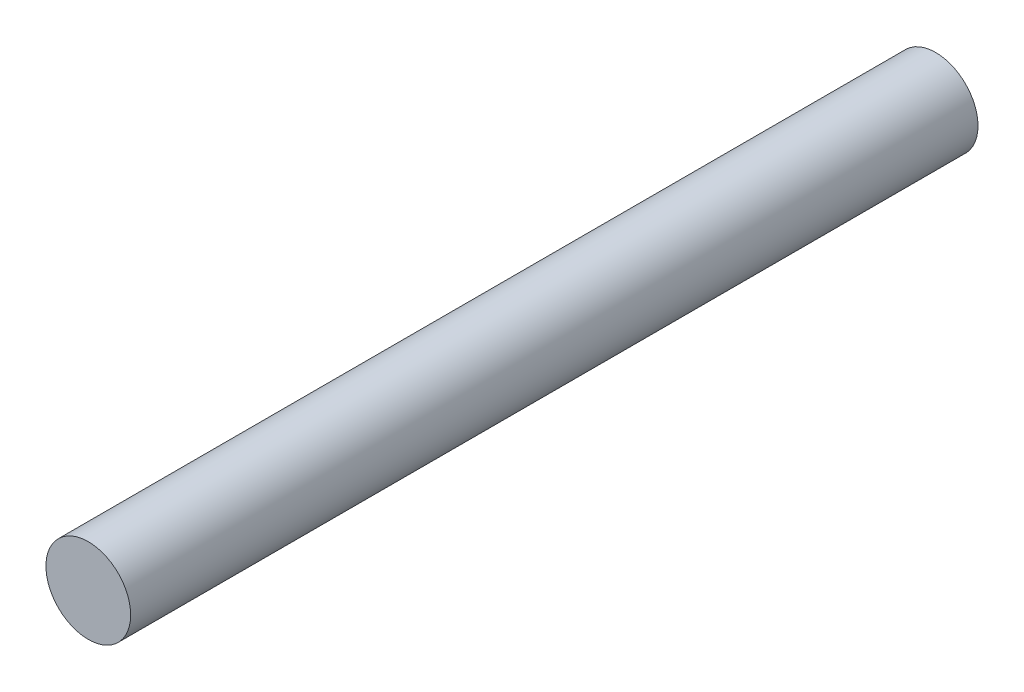
ISO-10303-21;
HEADER;
FILE_DESCRIPTION(('STEP AP214'),'2;1');
FILE_NAME('part.step','',(''),(''),'','','');
FILE_SCHEMA(('AUTOMOTIVE_DESIGN { 1 0 10303 214 1 1 1 1 }'));
ENDSEC;
DATA;
#1=APPLICATION_CONTEXT('core data for automotive mechanical design processes');
#2=APPLICATION_PROTOCOL_DEFINITION('international standard','automotive_design',2000,#1);
#3=PRODUCT_CONTEXT('',#1,'mechanical');
#4=PRODUCT('Part','Part','',(#3));
#5=PRODUCT_RELATED_PRODUCT_CATEGORY('part','',(#4));
#6=PRODUCT_DEFINITION_FORMATION('','',#4);
#7=PRODUCT_DEFINITION_CONTEXT('part definition',#1,'design');
#8=PRODUCT_DEFINITION('design','',#6,#7);
#9=PRODUCT_DEFINITION_SHAPE('','',#8);
#10=(LENGTH_UNIT() NAMED_UNIT(*) SI_UNIT(.MILLI.,.METRE.));
#11=(NAMED_UNIT(*) PLANE_ANGLE_UNIT() SI_UNIT($,.RADIAN.));
#12=(NAMED_UNIT(*) SI_UNIT($,.STERADIAN.) SOLID_ANGLE_UNIT());
#13=UNCERTAINTY_MEASURE_WITH_UNIT(LENGTH_MEASURE(1.E-05),#10,'distance_accuracy_value','');
#14=(GEOMETRIC_REPRESENTATION_CONTEXT(3) GLOBAL_UNCERTAINTY_ASSIGNED_CONTEXT((#13)) GLOBAL_UNIT_ASSIGNED_CONTEXT((#10,
#11,#12)) REPRESENTATION_CONTEXT('',''));
#15=CARTESIAN_POINT('',(0.,0.,0.));
#16=DIRECTION('',(0.,0.,1.));
#17=DIRECTION('',(1.,0.,0.));
#18=AXIS2_PLACEMENT_3D('',#15,#16,#17);
#19=CARTESIAN_POINT('',(0.,0.,15.));
#20=DIRECTION('',(0.,0.,-1.));
#21=DIRECTION('',(-1.,0.,0.));
#22=AXIS2_PLACEMENT_3D('',#19,#20,#21);
#23=CYLINDRICAL_SURFACE('',#22,0.75);
#24=CARTESIAN_POINT('',(0.,0.,15.));
#25=DIRECTION('',(0.,0.,1.));
#26=DIRECTION('',(1.,0.,0.));
#27=AXIS2_PLACEMENT_3D('',#24,#25,#26);
#28=CIRCLE('',#27,0.75);
#29=CARTESIAN_POINT('',(0.75,0.,15.));
#30=VERTEX_POINT('',#29);
#31=EDGE_CURVE('E10',#30,#30,#28,.T.);
#32=ORIENTED_EDGE('',*,*,#31,.F.);
#33=EDGE_LOOP('',(#32));
#34=FACE_BOUND('',#33,.T.);
#35=CARTESIAN_POINT('',(0.,0.,0.));
#36=DIRECTION('',(0.,0.,1.));
#37=DIRECTION('',(1.,0.,0.));
#38=AXIS2_PLACEMENT_3D('',#35,#36,#37);
#39=CIRCLE('',#38,0.75);
#40=CARTESIAN_POINT('',(0.75,0.,0.));
#41=VERTEX_POINT('',#40);
#42=EDGE_CURVE('E38',#41,#41,#39,.T.);
#43=ORIENTED_EDGE('',*,*,#42,.T.);
#44=EDGE_LOOP('',(#43));
#45=FACE_BOUND('',#44,.T.);
#46=ADVANCED_FACE('F35',(#34,#45),#23,.T.);
#47=CARTESIAN_POINT('',(0.,0.,15.));
#48=DIRECTION('',(0.,0.,1.));
#49=DIRECTION('',(1.,0.,0.));
#50=AXIS2_PLACEMENT_3D('',#47,#48,#49);
#51=PLANE('',#50);
#52=ORIENTED_EDGE('',*,*,#31,.T.);
#53=EDGE_LOOP('',(#52));
#54=FACE_BOUND('',#53,.T.);
#55=ADVANCED_FACE('F50',(#54),#51,.T.);
#56=CARTESIAN_POINT('',(0.,0.,0.));
#57=DIRECTION('',(0.,0.,1.));
#58=DIRECTION('',(1.,0.,0.));
#59=AXIS2_PLACEMENT_3D('',#56,#57,#58);
#60=PLANE('',#59);
#61=ORIENTED_EDGE('',*,*,#42,.F.);
#62=EDGE_LOOP('',(#61));
#63=FACE_BOUND('',#62,.T.);
#64=ADVANCED_FACE('F48',(#63),#60,.F.);
#65=CLOSED_SHELL('',(#46,#55,#64));
#66=MANIFOLD_SOLID_BREP('B2',#65);
#67=ADVANCED_BREP_SHAPE_REPRESENTATION('',(#18,#66),#14);
#68=SHAPE_DEFINITION_REPRESENTATION(#9,#67);
ENDSEC;
END-ISO-10303-21;
